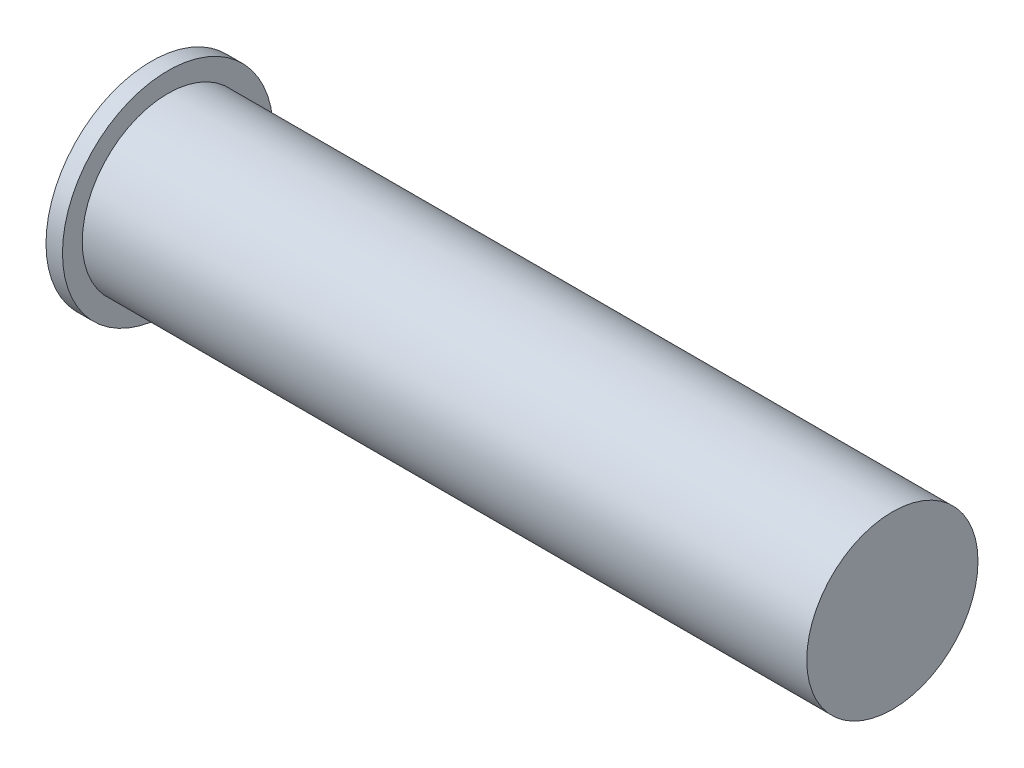
ISO-10303-21;
HEADER;
FILE_DESCRIPTION(('STEP AP214'),'2;1');
FILE_NAME('part.step','',(''),(''),'','','');
FILE_SCHEMA(('AUTOMOTIVE_DESIGN { 1 0 10303 214 1 1 1 1 }'));
ENDSEC;
DATA;
#1=APPLICATION_CONTEXT('core data for automotive mechanical design processes');
#2=APPLICATION_PROTOCOL_DEFINITION('international standard','automotive_design',2000,#1);
#3=PRODUCT_CONTEXT('',#1,'mechanical');
#4=PRODUCT('Part','Part','',(#3));
#5=PRODUCT_RELATED_PRODUCT_CATEGORY('part','',(#4));
#6=PRODUCT_DEFINITION_FORMATION('','',#4);
#7=PRODUCT_DEFINITION_CONTEXT('part definition',#1,'design');
#8=PRODUCT_DEFINITION('design','',#6,#7);
#9=PRODUCT_DEFINITION_SHAPE('','',#8);
#10=(LENGTH_UNIT() NAMED_UNIT(*) SI_UNIT(.MILLI.,.METRE.));
#11=(NAMED_UNIT(*) PLANE_ANGLE_UNIT() SI_UNIT($,.RADIAN.));
#12=(NAMED_UNIT(*) SI_UNIT($,.STERADIAN.) SOLID_ANGLE_UNIT());
#13=UNCERTAINTY_MEASURE_WITH_UNIT(LENGTH_MEASURE(1.E-05),#10,'distance_accuracy_value','');
#14=(GEOMETRIC_REPRESENTATION_CONTEXT(3) GLOBAL_UNCERTAINTY_ASSIGNED_CONTEXT((#13)) GLOBAL_UNIT_ASSIGNED_CONTEXT((#10,
#11,#12)) REPRESENTATION_CONTEXT('',''));
#15=CARTESIAN_POINT('',(0.,0.,0.));
#16=DIRECTION('',(0.,0.,1.));
#17=DIRECTION('',(1.,0.,0.));
#18=AXIS2_PLACEMENT_3D('',#15,#16,#17);
#19=CARTESIAN_POINT('',(0.,0.,0.));
#20=DIRECTION('',(1.,0.,0.));
#21=DIRECTION('',(0.,0.,-1.));
#22=AXIS2_PLACEMENT_3D('',#19,#20,#21);
#23=PLANE('',#22);
#24=CARTESIAN_POINT('',(0.,0.,0.));
#25=DIRECTION('',(-1.,0.,0.));
#26=DIRECTION('',(0.,0.,1.));
#27=AXIS2_PLACEMENT_3D('',#24,#25,#26);
#28=CIRCLE('',#27,32.);
#29=CARTESIAN_POINT('',(0.,0.,32.));
#30=VERTEX_POINT('',#29);
#31=EDGE_CURVE('E10',#30,#30,#28,.T.);
#32=ORIENTED_EDGE('',*,*,#31,.T.);
#33=EDGE_LOOP('',(#32));
#34=FACE_BOUND('',#33,.T.);
#35=ADVANCED_FACE('F33',(#34),#23,.F.);
#36=CARTESIAN_POINT('',(0.,0.,0.));
#37=DIRECTION('',(-1.,0.,0.));
#38=DIRECTION('',(0.,0.,1.));
#39=AXIS2_PLACEMENT_3D('',#36,#37,#38);
#40=CYLINDRICAL_SURFACE('',#39,32.);
#41=ORIENTED_EDGE('',*,*,#31,.F.);
#42=EDGE_LOOP('',(#41));
#43=FACE_BOUND('',#42,.T.);
#44=CARTESIAN_POINT('',(5.,0.,0.));
#45=DIRECTION('',(-1.,0.,0.));
#46=DIRECTION('',(0.,0.,1.));
#47=AXIS2_PLACEMENT_3D('',#44,#45,#46);
#48=CIRCLE('',#47,32.);
#49=CARTESIAN_POINT('',(5.,0.,32.));
#50=VERTEX_POINT('',#49);
#51=EDGE_CURVE('E44',#50,#50,#48,.T.);
#52=ORIENTED_EDGE('',*,*,#51,.T.);
#53=EDGE_LOOP('',(#52));
#54=FACE_BOUND('',#53,.T.);
#55=ADVANCED_FACE('F73',(#43,#54),#40,.T.);
#56=CARTESIAN_POINT('',(5.,32.,0.));
#57=DIRECTION('',(-1.,0.,0.));
#58=DIRECTION('',(0.,0.,1.));
#59=AXIS2_PLACEMENT_3D('',#56,#57,#58);
#60=PLANE('',#59);
#61=ORIENTED_EDGE('',*,*,#51,.F.);
#62=EDGE_LOOP('',(#61));
#63=FACE_BOUND('',#62,.T.);
#64=CARTESIAN_POINT('',(5.,0.,0.));
#65=DIRECTION('',(-1.,0.,0.));
#66=DIRECTION('',(0.,0.,1.));
#67=AXIS2_PLACEMENT_3D('',#64,#65,#66);
#68=CIRCLE('',#67,26.);
#69=CARTESIAN_POINT('',(5.,0.,26.));
#70=VERTEX_POINT('',#69);
#71=EDGE_CURVE('E48',#70,#70,#68,.T.);
#72=ORIENTED_EDGE('',*,*,#71,.T.);
#73=EDGE_LOOP('',(#72));
#74=FACE_BOUND('',#73,.T.);
#75=ADVANCED_FACE('F77',(#63,#74),#60,.F.);
#76=CARTESIAN_POINT('',(0.,0.,0.));
#77=DIRECTION('',(-1.,0.,0.));
#78=DIRECTION('',(0.,0.,1.));
#79=AXIS2_PLACEMENT_3D('',#76,#77,#78);
#80=CYLINDRICAL_SURFACE('',#79,26.);
#81=CARTESIAN_POINT('',(105.,-18.7616630392937,-18.));
#82=CARTESIAN_POINT('',(105.215145203616,-18.7616630550526,-18.000000073425));
#83=CARTESIAN_POINT('',(105.430292984133,-18.7549982520312,-18.0069545608265));
#84=CARTESIAN_POINT('',(105.858955343133,-18.7283749265113,-18.0346427285474));
#85=CARTESIAN_POINT('',(106.072469230762,-18.708411064416,-18.0553819434527));
#86=CARTESIAN_POINT('',(106.496422864319,-18.6552689123506,-18.1102843518652));
#87=CARTESIAN_POINT('',(106.706857554416,-18.6220709724645,-18.1444675058722));
#88=CARTESIAN_POINT('',(107.122723413872,-18.5426744265266,-18.2255984746961));
#89=CARTESIAN_POINT('',(107.328155079569,-18.4964771158663,-18.2725450176214));
#90=CARTESIAN_POINT('',(107.731874451136,-18.3915629358357,-18.3781371216339));
#91=CARTESIAN_POINT('',(107.930184993449,-18.3328912385536,-18.4367404233388));
#92=CARTESIAN_POINT('',(108.31918196415,-18.2033057748199,-18.5646961407173));
#93=CARTESIAN_POINT('',(108.509868250957,-18.1323917811632,-18.6340487558852));
#94=CARTESIAN_POINT('',(108.882476215996,-17.9788136937753,-18.7822690656587));
#95=CARTESIAN_POINT('',(109.064402108458,-17.8961553268871,-18.8611321199239));
#96=CARTESIAN_POINT('',(109.418829803417,-17.7195578217671,-19.0271375281067));
#97=CARTESIAN_POINT('',(109.59132800142,-17.6256144122155,-19.1142830142517));
#98=CARTESIAN_POINT('',(109.932133324304,-17.4235508293688,-19.2986840153793));
#99=CARTESIAN_POINT('',(110.100079473552,-17.3150481643934,-19.3961873578979));
#100=CARTESIAN_POINT('',(110.424789464762,-17.0872907811786,-19.5971335463342));
#101=CARTESIAN_POINT('',(110.581549019604,-16.9680319800047,-19.7005786422323));
#102=CARTESIAN_POINT('',(111.034703943968,-16.5951810724033,-20.017638365992));
#103=CARTESIAN_POINT('',(111.31412813515,-16.3264230721519,-20.2380622782175));
#104=CARTESIAN_POINT('',(111.767174615605,-15.8227057925485,-20.6329623674264));
#105=CARTESIAN_POINT('',(111.950184621147,-15.5948051793248,-20.8059639891914));
#106=CARTESIAN_POINT('',(112.29177867477,-15.1215182115478,-21.1524377591218));
#107=CARTESIAN_POINT('',(112.450352424108,-14.876124547867,-21.3259100744908));
#108=CARTESIAN_POINT('',(112.745106324898,-14.369801747743,-21.6703199419451));
#109=CARTESIAN_POINT('',(112.88124212164,-14.108843196889,-21.8412518798589));
#110=CARTESIAN_POINT('',(113.132930994185,-13.5739061948176,-22.1776688942535));
#111=CARTESIAN_POINT('',(113.248483939189,-13.2999276608755,-22.3431539361153));
#112=CARTESIAN_POINT('',(113.51328227435,-12.6040553132261,-22.7457398365178));
#113=CARTESIAN_POINT('',(113.651404590492,-12.1752958482275,-22.9783267954071));
#114=CARTESIAN_POINT('',(113.8942877226,-11.2977800342923,-23.4222627374707));
#115=CARTESIAN_POINT('',(113.999032156337,-10.8490139887001,-23.6336012569563));
#116=CARTESIAN_POINT('',(114.181771926857,-9.93483788771005,-24.0322303413969));
#117=CARTESIAN_POINT('',(114.259723568636,-9.46940199821615,-24.2194813149822));
#118=CARTESIAN_POINT('',(114.394306137684,-8.5258007998565,-24.567532082589));
#119=CARTESIAN_POINT('',(114.450937657416,-8.04763584511321,-24.7283326115701));
#120=CARTESIAN_POINT('',(114.532186563724,-7.23532209800863,-24.9753594909323));
#121=CARTESIAN_POINT('',(114.561254856269,-6.90384054494018,-25.0690204979413));
#122=CARTESIAN_POINT('',(114.612927774929,-6.23691473094506,-25.2432101301687));
#123=CARTESIAN_POINT('',(114.635531970827,-5.90147020781066,-25.3237378811544));
#124=CARTESIAN_POINT('',(114.675345186018,-5.22725126424045,-25.4714543954495));
#125=CARTESIAN_POINT('',(114.692552716479,-4.88847595144547,-25.5386394759139));
#126=CARTESIAN_POINT('',(114.722441576909,-4.20833242395352,-25.6594862454576));
#127=CARTESIAN_POINT('',(114.735122991421,-3.86696425781047,-25.7131481871318));
#128=CARTESIAN_POINT('',(114.756661366152,-3.18207393514851,-25.8068582238358));
#129=CARTESIAN_POINT('',(114.765516423978,-2.83855079312386,-25.8468995448492));
#130=CARTESIAN_POINT('',(114.779909683499,-2.15011165348116,-25.9132516044068));
#131=CARTESIAN_POINT('',(114.785447871861,-1.80519565026939,-25.9395622877535));
#132=CARTESIAN_POINT('',(114.793545142569,-1.11459892487203,-25.9783999184127));
#133=CARTESIAN_POINT('',(114.796104609403,-0.768918307153774,-25.9909286446616));
#134=CARTESIAN_POINT('',(114.79840641719,-0.0773235508942799,-26.0021850793469));
#135=CARTESIAN_POINT('',(114.798148758999,0.268590587576077,-26.0009127919706));
#136=CARTESIAN_POINT('',(114.794785326904,0.963144043784889,-25.9844970763604));
#137=CARTESIAN_POINT('',(114.791654332968,1.31178034536149,-25.9692308207004));
#138=CARTESIAN_POINT('',(114.782309381089,2.00811703157598,-25.9246829014944));
#139=CARTESIAN_POINT('',(114.77609541009,2.3558174122442,-25.8954011785962));
#140=CARTESIAN_POINT('',(114.760199612029,3.04974693899538,-25.8228729036731));
#141=CARTESIAN_POINT('',(114.750517130873,3.39597579510808,-25.7796237178106));
#142=CARTESIAN_POINT('',(114.727115876115,4.08627924204573,-25.6792517028494));
#143=CARTESIAN_POINT('',(114.7133971318,4.43035384848347,-25.6221289744181));
#144=CARTESIAN_POINT('',(114.681183081942,5.11538216799274,-25.4941983978021));
#145=CARTESIAN_POINT('',(114.662692417876,5.456338582192,-25.423403864442));
#146=CARTESIAN_POINT('',(114.619984357568,6.13480797078492,-25.2682652892508));
#147=CARTESIAN_POINT('',(114.595766794155,6.47232084435884,-25.1839208519103));
#148=CARTESIAN_POINT('',(114.540480190528,7.14303689912985,-25.0019539890828));
#149=CARTESIAN_POINT('',(114.509414051787,7.47624184233025,-24.904337193267));
#150=CARTESIAN_POINT('',(114.439093775461,8.13765883332853,-24.6961275796443));
#151=CARTESIAN_POINT('',(114.399840491185,8.46587139763814,-24.5855361146551));
#152=CARTESIAN_POINT('',(114.299559442529,9.20536691475665,-24.319844089735));
#153=CARTESIAN_POINT('',(114.235512708835,9.61485409706201,-24.1608369050404));
#154=CARTESIAN_POINT('',(114.088016174036,10.4223127008268,-23.8236600363328));
#155=CARTESIAN_POINT('',(114.004567195973,10.8202846099583,-23.6454911653295));
#156=CARTESIAN_POINT('',(113.814217358778,11.6016600193649,-23.2720577854917));
#157=CARTESIAN_POINT('',(113.707352236075,11.9850846859655,-23.0768195968644));
#158=CARTESIAN_POINT('',(113.465471526726,12.734920135646,-22.6716378827991));
#159=CARTESIAN_POINT('',(113.330465298602,13.1013365255418,-22.4616992614681));
#160=CARTESIAN_POINT('',(113.070207318489,13.7129096299724,-22.0917505429311));
#161=CARTESIAN_POINT('',(112.952969021798,13.9630866469307,-21.9343846356583));
#162=CARTESIAN_POINT('',(112.699661224494,14.4512028342875,-21.6159098905872));
#163=CARTESIAN_POINT('',(112.563596678316,14.6891452019093,-21.4548020467922));
#164=CARTESIAN_POINT('',(112.27106724457,15.1508312067272,-21.131296717748));
#165=CARTESIAN_POINT('',(112.114622722853,15.3745886914704,-20.96890066996));
#166=CARTESIAN_POINT('',(111.779803993097,15.8061751171331,-20.6455195271289));
#167=CARTESIAN_POINT('',(111.601435054682,16.0140078662086,-20.4845341029634));
#168=CARTESIAN_POINT('',(111.262865666323,16.3686499715494,-20.201660805441));
#169=CARTESIAN_POINT('',(111.107075714262,16.5189374247843,-20.0788454757299));
#170=CARTESIAN_POINT('',(110.781255955684,16.8073994454184,-19.8380089949124));
#171=CARTESIAN_POINT('',(110.611229581384,16.94557691603,-19.719986698399));
#172=CARTESIAN_POINT('',(110.257021569796,17.2088111711628,-19.4906977433285));
#173=CARTESIAN_POINT('',(110.072840272565,17.3338682707158,-19.3794309225936));
#174=CARTESIAN_POINT('',(109.690781018469,17.5698738556493,-19.1657216336093));
#175=CARTESIAN_POINT('',(109.492902847554,17.6808221204636,-19.0632793033229));
#176=CARTESIAN_POINT('',(109.08264948563,17.8885279447057,-18.8685191977892));
#177=CARTESIAN_POINT('',(108.870169269919,17.9851624555078,-18.7762907605086));
#178=CARTESIAN_POINT('',(108.433471363109,18.1623146966189,-18.6049865791325));
#179=CARTESIAN_POINT('',(108.209253352062,18.2428319873166,-18.5259111938078));
#180=CARTESIAN_POINT('',(107.750918823508,18.3870080456207,-18.3828251588379));
#181=CARTESIAN_POINT('',(107.516807026735,18.4506747503327,-18.3188074182007));
#182=CARTESIAN_POINT('',(107.040691031945,18.56063869829,-18.2073842368988));
#183=CARTESIAN_POINT('',(106.798688066187,18.6069386394837,-18.159976215969));
#184=CARTESIAN_POINT('',(106.342063049069,18.6767559629389,-18.0881433748912));
#185=CARTESIAN_POINT('',(106.128126968446,18.7024974986468,-18.0614874366958));
#186=CARTESIAN_POINT('',(105.697800025533,18.7405158591514,-18.0220372070667));
#187=CARTESIAN_POINT('',(105.48140938895,18.7527939119914,-18.0092416513884));
#188=CARTESIAN_POINT('',(105.047993626685,18.7638074919141,-17.9977662651449));
#189=CARTESIAN_POINT('',(104.83096876777,18.7625480685795,-17.9990811712687));
#190=CARTESIAN_POINT('',(104.397964526059,18.7465068648154,-18.0157879526311));
#191=CARTESIAN_POINT('',(104.181985123007,18.7317253474663,-18.0311795539993));
#192=CARTESIAN_POINT('',(103.765963312242,18.6900527505014,-18.0743675142139));
#193=CARTESIAN_POINT('',(103.56575499122,18.6639587922574,-18.1013463833588));
#194=CARTESIAN_POINT('',(103.169165289857,18.6000865124478,-18.166972126472));
#195=CARTESIAN_POINT('',(102.972783689913,18.562308863484,-18.2056183287772));
#196=CARTESIAN_POINT('',(102.585134673882,18.4752872332041,-18.2939224269629));
#197=CARTESIAN_POINT('',(102.393866713654,18.4260444773473,-18.3435791459465));
#198=CARTESIAN_POINT('',(102.017563623351,18.3163709096891,-18.4530906969644));
#199=CARTESIAN_POINT('',(101.832528701226,18.2559397250518,-18.51294586884));
#200=CARTESIAN_POINT('',(101.464536472309,18.1223657643629,-18.6437345026399));
#201=CARTESIAN_POINT('',(101.281787355549,18.0489107617835,-18.7149342770445));
#202=CARTESIAN_POINT('',(100.924832771,17.8909824667397,-18.8659661209558));
#203=CARTESIAN_POINT('',(100.750627375475,17.8065090811033,-18.9457982634574));
#204=CARTESIAN_POINT('',(100.411441516715,17.6270470303054,-19.1128814469465));
#205=CARTESIAN_POINT('',(100.246461408839,17.5320579604973,-19.2001327733966));
#206=CARTESIAN_POINT('',(99.9261613556096,17.3320907570863,-19.3808357759112));
#207=CARTESIAN_POINT('',(99.7708449478547,17.2271090006176,-19.4742896969914));
#208=CARTESIAN_POINT('',(99.4534877539122,16.9955666186064,-19.6768116029606));
#209=CARTESIAN_POINT('',(99.2926210834373,16.867904652009,-19.7864600291167));
#210=CARTESIAN_POINT('',(98.9833198650359,16.6018049659419,-20.0102551381014));
#211=CARTESIAN_POINT('',(98.8348902695379,16.4633629958243,-20.1244035864786));
#212=CARTESIAN_POINT('',(98.5503972111592,16.1765821918767,-20.3556406108714));
#213=CARTESIAN_POINT('',(98.4143346279664,16.0282426553142,-20.4727293952835));
#214=CARTESIAN_POINT('',(98.1542492949416,15.7224959537231,-20.7084628871522));
#215=CARTESIAN_POINT('',(98.0302293052796,15.5650867230261,-20.8271079442675));
#216=CARTESIAN_POINT('',(97.7218481490856,15.1437209638646,-21.1369700313618));
#217=CARTESIAN_POINT('',(97.5466624773493,14.8731883446614,-21.3284383778581));
#218=CARTESIAN_POINT('',(97.2237306718489,14.3138302291496,-21.7078015476562));
#219=CARTESIAN_POINT('',(97.0759980563192,14.0249958141777,-21.8956945697644));
#220=CARTESIAN_POINT('',(96.8047818312172,13.4311325952627,-22.2649328433709));
#221=CARTESIAN_POINT('',(96.6813572892351,13.1260665771782,-22.4462612922739));
#222=CARTESIAN_POINT('',(96.4561782247125,12.5027532295571,-22.7993307064331));
#223=CARTESIAN_POINT('',(96.3544232856906,12.1845061534959,-22.9710718559067));
#224=CARTESIAN_POINT('',(96.1925324183879,11.6170465056463,-23.2619700964794));
#225=CARTESIAN_POINT('',(96.1283295382467,11.3702488577648,-23.3836191993588));
#226=CARTESIAN_POINT('',(96.0093577502433,10.8710420885557,-23.6198378761579));
#227=CARTESIAN_POINT('',(95.9545898357951,10.6186323794854,-23.734406703777));
#228=CARTESIAN_POINT('',(95.802742086966,9.85381387614325,-24.0668058959664));
#229=CARTESIAN_POINT('',(95.7181448814213,9.33391271262072,-24.2732790954757));
#230=CARTESIAN_POINT('',(95.5744867541859,8.27850810525007,-24.6532232686465));
#231=CARTESIAN_POINT('',(95.5154449233427,7.74299331507404,-24.8266695159194));
#232=CARTESIAN_POINT('',(95.4166737560581,6.66029459863111,-25.1387715137019));
#233=CARTESIAN_POINT('',(95.3769418074182,6.11311226118446,-25.2774319687288));
#234=CARTESIAN_POINT('',(95.3103409191356,4.98442666616867,-25.5245888943369));
#235=CARTESIAN_POINT('',(95.2841564923917,4.40251110406633,-25.6313816921104));
#236=CARTESIAN_POINT('',(95.2434514011446,3.23235152018818,-25.8050730137757));
#237=CARTESIAN_POINT('',(95.2289311775078,2.64410726006108,-25.8719700297209));
#238=CARTESIAN_POINT('',(95.2090310931128,1.46405550103073,-25.9654971037822));
#239=CARTESIAN_POINT('',(95.2036548833637,0.872246673472066,-25.9921110772743));
#240=CARTESIAN_POINT('',(95.2010437152359,-0.311897422046504,-26.0048696880509));
#241=CARTESIAN_POINT('',(95.2038091483856,-0.904232713954478,-25.9910123790867));
#242=CARTESIAN_POINT('',(95.2151871663661,-1.84948118492168,-25.9365644373195));
#243=CARTESIAN_POINT('',(95.2210127930879,-2.20322559380114,-25.9089107139107));
#244=CARTESIAN_POINT('',(95.2361858229951,-2.90924116250054,-25.8391586574559));
#245=CARTESIAN_POINT('',(95.2455333449886,-3.26151227221453,-25.7970598371206));
#246=CARTESIAN_POINT('',(95.268319575204,-3.96402270145665,-25.6984899158907));
#247=CARTESIAN_POINT('',(95.2817596439887,-4.31426130576038,-25.6420140363832));
#248=CARTESIAN_POINT('',(95.3135036652108,-5.01192067024979,-25.5148264617416));
#249=CARTESIAN_POINT('',(95.3318075338145,-5.35934147889734,-25.4441150119805));
#250=CARTESIAN_POINT('',(95.3742339875918,-6.0503383028361,-25.2887067841537));
#251=CARTESIAN_POINT('',(95.3983510064764,-6.39391766909216,-25.2040234090088));
#252=CARTESIAN_POINT('',(95.4535935817282,-7.07683237012719,-25.0208598002209));
#253=CARTESIAN_POINT('',(95.4847194318311,-7.41616752640459,-24.9223789884012));
#254=CARTESIAN_POINT('',(95.5553498670127,-8.08956107447088,-24.7120080897919));
#255=CARTESIAN_POINT('',(95.5948494502763,-8.42362248895612,-24.6001260251426));
#256=CARTESIAN_POINT('',(95.6838386191515,-9.08570911123008,-24.3633635044635));
#257=CARTESIAN_POINT('',(95.7333267704734,-9.41373517828253,-24.2384849158908));
#258=CARTESIAN_POINT('',(95.8527380687734,-10.1132554178296,-23.955908771144));
#259=CARTESIAN_POINT('',(95.9246421407306,-10.4835780680533,-23.796127364435));
#260=CARTESIAN_POINT('',(96.087404683426,-11.2129832059916,-23.4612448528867));
#261=CARTESIAN_POINT('',(96.1782618954307,-11.5720664383285,-23.286144765854));
#262=CARTESIAN_POINT('',(96.3823251424404,-12.2762751472893,-22.9226920950266));
#263=CARTESIAN_POINT('',(96.4954974522926,-12.6214207511802,-22.7343597824234));
#264=CARTESIAN_POINT('',(96.7480722175397,-13.2956207745486,-22.3467555392098));
#265=CARTESIAN_POINT('',(96.8874674967682,-13.6246795653708,-22.1474866120503));
#266=CARTESIAN_POINT('',(97.1578244713599,-14.1838356592482,-21.7921914804629));
#267=CARTESIAN_POINT('',(97.2822144453342,-14.4181414521356,-21.6377793871339));
#268=CARTESIAN_POINT('',(97.5495262782451,-14.8743590751794,-21.3267340267586));
#269=CARTESIAN_POINT('',(97.6924434290265,-15.0962740336856,-21.1701013329907));
#270=CARTESIAN_POINT('',(97.9980855141609,-15.525844676191,-20.8571023065459));
#271=CARTESIAN_POINT('',(98.1607911264215,-15.7335139650342,-20.7007358628264));
#272=CARTESIAN_POINT('',(98.5071979396905,-16.1329637114086,-20.3909616017351));
#273=CARTESIAN_POINT('',(98.6908941864874,-16.3247478997866,-20.2375530961797));
#274=CARTESIAN_POINT('',(99.0389246511923,-16.6520166743668,-19.9686086919871));
#275=CARTESIAN_POINT('',(99.1992009546152,-16.7908568519621,-19.8518954126529));
#276=CARTESIAN_POINT('',(99.5331947899381,-17.0564751602282,-19.6241494205321));
#277=CARTESIAN_POINT('',(99.7069092079195,-17.1832560702158,-19.5131154015784));
#278=CARTESIAN_POINT('',(100.067572318622,-17.4238885824164,-19.2985521612215));
#279=CARTESIAN_POINT('',(100.254525456299,-17.5377358083578,-19.1950254842803));
#280=CARTESIAN_POINT('',(100.640975255608,-17.7515708822331,-18.9974454138359));
#281=CARTESIAN_POINT('',(100.84047180002,-17.8515588596557,-18.9033919318259));
#282=CARTESIAN_POINT('',(101.252643166338,-18.037615275143,-18.7259474351889));
#283=CARTESIAN_POINT('',(101.465410347109,-18.1235664228547,-18.6426473750224));
#284=CARTESIAN_POINT('',(101.901296041657,-18.2798760519121,-18.4894058404009));
#285=CARTESIAN_POINT('',(102.12441595265,-18.3502324211265,-18.4194661756331));
#286=CARTESIAN_POINT('',(102.578741806493,-18.4746253126436,-18.2946980238957));
#287=CARTESIAN_POINT('',(102.809929823445,-18.528695727569,-18.2398381754904));
#288=CARTESIAN_POINT('',(103.2786681253,-18.6202483774542,-18.1463673411324));
#289=CARTESIAN_POINT('',(103.516214642561,-18.6577402147594,-18.1077469498914));
#290=CARTESIAN_POINT('',(103.961144258889,-18.7117135328596,-18.0519539429667));
#291=CARTESIAN_POINT('',(104.16797541511,-18.7304349230691,-18.0325019213811));
#292=CARTESIAN_POINT('',(104.583203589304,-18.7554095830341,-18.0065250031081));
#293=CARTESIAN_POINT('',(104.791600585733,-18.7616630240288,-17.9999999288772));
#294=CARTESIAN_POINT('',(105.,-18.7616630392937,-18.));
#295=B_SPLINE_CURVE_WITH_KNOTS('',3,(#81,#82,#83,#84,#85,#86,#87,#88,#89,#90,#91,#92,#93,#94,
#95,#96,#97,#98,#99,#100,#101,#102,#103,#104,#105,#106,#107,#108,#109,#110,#111,#112,#113,#114,
#115,#116,#117,#118,#119,#120,#121,#122,#123,#124,#125,#126,#127,#128,#129,#130,#131,#132,#133,
#134,#135,#136,#137,#138,#139,#140,#141,#142,#143,#144,#145,#146,#147,#148,#149,#150,#151,#152,
#153,#154,#155,#156,#157,#158,#159,#160,#161,#162,#163,#164,#165,#166,#167,#168,#169,#170,#171,
#172,#173,#174,#175,#176,#177,#178,#179,#180,#181,#182,#183,#184,#185,#186,#187,#188,#189,#190,
#191,#192,#193,#194,#195,#196,#197,#198,#199,#200,#201,#202,#203,#204,#205,#206,#207,#208,#209,
#210,#211,#212,#213,#214,#215,#216,#217,#218,#219,#220,#221,#222,#223,#224,#225,#226,#227,#228,
#229,#230,#231,#232,#233,#234,#235,#236,#237,#238,#239,#240,#241,#242,#243,#244,#245,#246,#247,
#248,#249,#250,#251,#252,#253,#254,#255,#256,#257,#258,#259,#260,#261,#262,#263,#264,#265,#266,
#267,#268,#269,#270,#271,#272,#273,#274,#275,#276,#277,#278,#279,#280,#281,#282,#283,#284,#285,
#286,#287,#288,#289,#290,#291,#292,#293,#294),.UNSPECIFIED.,.T.,.F.,(4,2,2,2,2,2,2,2,2,2,2,2,2,
2,2,2,2,2,2,2,2,2,2,2,2,2,2,2,2,2,2,2,2,2,2,2,2,2,2,2,2,2,2,2,2,2,2,2,2,2,2,2,2,2,2,2,2,2,2,2,2,
2,2,2,2,2,2,2,2,2,2,2,2,2,2,2,2,2,2,2,2,2,2,2,2,2,2,2,2,2,2,2,2,2,2,2,2,2,2,2,2,2,2,2,2,2,4),
(0.,0.645225727078084,1.29071066973912,1.93715761755066,2.58354016951248,3.22762074571861,
3.87171327671711,4.51549280355264,5.15951676934219,5.82619924640851,6.49313586400491,
7.8264234783923,8.84410552639342,9.86221531377737,10.882314141146,11.9024194507472,
13.4209385933129,14.9402018977188,16.4619312641608,17.9836183402583,19.0203615023636,
20.0571736485174,21.0942715790992,22.1313501365822,23.1689437184009,24.2065414713453,
25.2440052783659,26.2814687706178,27.3281263613401,28.3747883844426,29.4216478914332,
30.4684998025741,31.514337290882,32.5602053117774,33.6056310879252,34.6509479583423,
35.9817736317358,37.3125428618933,38.6412951180725,39.969606191307,40.9227741517624,
41.8756917459956,42.8276642849789,43.7794084592316,44.5253673724181,45.2711469595626,
46.0169086357832,46.7626819692133,47.514534516703,48.2664075688356,49.0179258345234,
49.7693273025082,50.4198486484625,51.0703106535357,51.7205300397032,52.3707367757337,
52.9811203625039,53.5914688175048,54.2017520647303,54.812055652299,55.439689145978,
56.0673279473087,56.6949909087757,57.3228823036488,58.0206248021185,58.7186438333643,
59.4167124771711,60.1149407429405,61.2378245474763,62.3612598175774,63.4873921891829,
64.6135029149955,65.4608205661021,66.3082273774234,68.0033766369635,69.6997900616986,
71.3959739354247,73.1710787657524,74.946250685716,76.7221312276126,78.4980971723387,
79.562436838415,80.6268124123356,81.6915422238496,82.7562536846093,83.8199496698835,
84.8836902423076,85.9467972004251,87.0097516121522,88.2379783739433,89.4661235915559,
90.6924267276392,91.9183947610418,92.8385136648518,93.7583992032864,94.6773936402632,
95.5961716223648,96.3216420390522,97.0469448483264,97.7724923463827,98.4980330651065,
99.2293563572937,99.9607786382715,100.690668072018,101.42013419682,102.04513772076,
102.670132660611),.UNSPECIFIED.);
#296=CARTESIAN_POINT('',(105.,-18.7616630392937,-18.));
#297=VERTEX_POINT('',#296);
#298=EDGE_CURVE('E36',#297,#297,#295,.T.);
#299=ORIENTED_EDGE('',*,*,#298,.T.);
#300=EDGE_LOOP('',(#299));
#301=FACE_BOUND('',#300,.T.);
#302=ORIENTED_EDGE('',*,*,#71,.F.);
#303=EDGE_LOOP('',(#302));
#304=FACE_BOUND('',#303,.T.);
#305=CARTESIAN_POINT('',(225.,0.,0.));
#306=DIRECTION('',(-1.,0.,0.));
#307=DIRECTION('',(0.,0.,1.));
#308=AXIS2_PLACEMENT_3D('',#305,#306,#307);
#309=CIRCLE('',#308,26.);
#310=CARTESIAN_POINT('',(225.,0.,26.));
#311=VERTEX_POINT('',#310);
#312=EDGE_CURVE('E53',#311,#311,#309,.T.);
#313=ORIENTED_EDGE('',*,*,#312,.T.);
#314=EDGE_LOOP('',(#313));
#315=FACE_BOUND('',#314,.T.);
#316=ADVANCED_FACE('F60',(#301,#304,#315),#80,.T.);
#317=CARTESIAN_POINT('',(225.,26.,0.));
#318=DIRECTION('',(-1.,0.,0.));
#319=DIRECTION('',(0.,0.,1.));
#320=AXIS2_PLACEMENT_3D('',#317,#318,#319);
#321=PLANE('',#320);
#322=ORIENTED_EDGE('',*,*,#312,.F.);
#323=EDGE_LOOP('',(#322));
#324=FACE_BOUND('',#323,.T.);
#325=ADVANCED_FACE('F65',(#324),#321,.F.);
#326=CARTESIAN_POINT('',(105.,-32.,-28.));
#327=DIRECTION('',(0.,1.,0.));
#328=DIRECTION('',(0.,0.,1.));
#329=AXIS2_PLACEMENT_3D('',#326,#327,#328);
#330=CYLINDRICAL_SURFACE('',#329,9.99999999999999);
#331=ORIENTED_EDGE('',*,*,#298,.F.);
#332=EDGE_LOOP('',(#331));
#333=FACE_BOUND('',#332,.T.);
#334=ADVANCED_FACE('F63',(#333),#330,.F.);
#335=CLOSED_SHELL('',(#35,#55,#75,#316,#325,#334));
#336=MANIFOLD_SOLID_BREP('B2',#335);
#337=ADVANCED_BREP_SHAPE_REPRESENTATION('',(#18,#336),#14);
#338=SHAPE_DEFINITION_REPRESENTATION(#9,#337);
ENDSEC;
END-ISO-10303-21;
